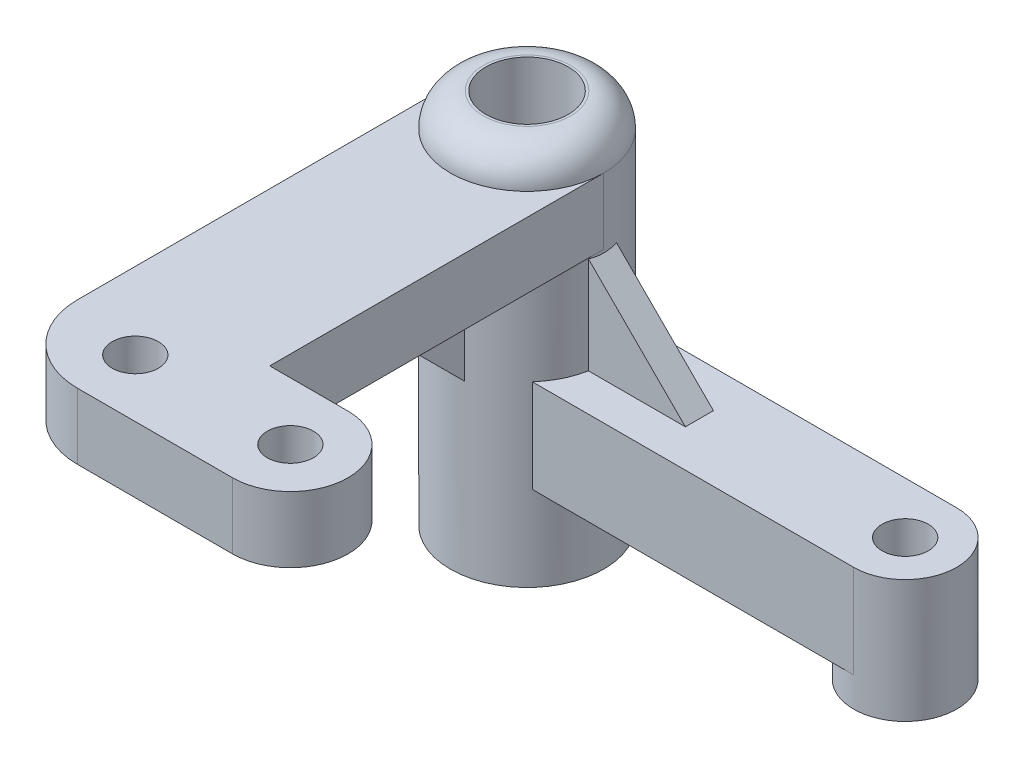
ISO-10303-21;
HEADER;
FILE_DESCRIPTION(('STEP AP214'),'2;1');
FILE_NAME('part.step','',(''),(''),'','','');
FILE_SCHEMA(('AUTOMOTIVE_DESIGN { 1 0 10303 214 1 1 1 1 }'));
ENDSEC;
DATA;
#1=APPLICATION_CONTEXT('core data for automotive mechanical design processes');
#2=APPLICATION_PROTOCOL_DEFINITION('international standard','automotive_design',2000,#1);
#3=PRODUCT_CONTEXT('',#1,'mechanical');
#4=PRODUCT('Part','Part','',(#3));
#5=PRODUCT_RELATED_PRODUCT_CATEGORY('part','',(#4));
#6=PRODUCT_DEFINITION_FORMATION('','',#4);
#7=PRODUCT_DEFINITION_CONTEXT('part definition',#1,'design');
#8=PRODUCT_DEFINITION('design','',#6,#7);
#9=PRODUCT_DEFINITION_SHAPE('','',#8);
#10=(LENGTH_UNIT() NAMED_UNIT(*) SI_UNIT(.MILLI.,.METRE.));
#11=(NAMED_UNIT(*) PLANE_ANGLE_UNIT() SI_UNIT($,.RADIAN.));
#12=(NAMED_UNIT(*) SI_UNIT($,.STERADIAN.) SOLID_ANGLE_UNIT());
#13=UNCERTAINTY_MEASURE_WITH_UNIT(LENGTH_MEASURE(1.E-05),#10,'distance_accuracy_value','');
#14=(GEOMETRIC_REPRESENTATION_CONTEXT(3) GLOBAL_UNCERTAINTY_ASSIGNED_CONTEXT((#13)) GLOBAL_UNIT_ASSIGNED_CONTEXT((#10,
#11,#12)) REPRESENTATION_CONTEXT('',''));
#15=CARTESIAN_POINT('',(0.,0.,0.));
#16=DIRECTION('',(0.,0.,1.));
#17=DIRECTION('',(1.,0.,0.));
#18=AXIS2_PLACEMENT_3D('',#15,#16,#17);
#19=CARTESIAN_POINT('',(0.,-11.65,0.));
#20=DIRECTION('',(0.,1.,0.));
#21=DIRECTION('',(0.,0.,1.));
#22=AXIS2_PLACEMENT_3D('',#19,#20,#21);
#23=PLANE('',#22);
#24=CARTESIAN_POINT('',(0.,-11.65,-22.6));
#25=DIRECTION('',(0.,1.,0.));
#26=DIRECTION('',(0.,0.,1.));
#27=AXIS2_PLACEMENT_3D('',#24,#25,#26);
#28=CIRCLE('',#27,4.65);
#29=CARTESIAN_POINT('',(3.44338133235342,-11.65,-19.475));
#30=VERTEX_POINT('',#29);
#31=CARTESIAN_POINT('',(3.44338133235342,-11.65,-25.725));
#32=VERTEX_POINT('',#31);
#33=EDGE_CURVE('E200',#30,#32,#28,.T.);
#34=ORIENTED_EDGE('',*,*,#33,.T.);
#35=DIRECTION('',(1.,0.,0.));
#36=VECTOR('',#35,1.);
#37=CARTESIAN_POINT('',(0.,-11.65,-25.725));
#38=LINE('',#37,#36);
#39=CARTESIAN_POINT('',(22.925,-11.65,-25.725));
#40=VERTEX_POINT('',#39);
#41=EDGE_CURVE('E208',#32,#40,#38,.T.);
#42=ORIENTED_EDGE('',*,*,#41,.T.);
#43=CARTESIAN_POINT('',(22.925,-11.65,-22.6));
#44=DIRECTION('',(0.,1.,0.));
#45=DIRECTION('',(0.,0.,1.));
#46=AXIS2_PLACEMENT_3D('',#43,#44,#45);
#47=CIRCLE('',#46,3.125);
#48=CARTESIAN_POINT('',(22.925,-11.65,-19.475));
#49=VERTEX_POINT('',#48);
#50=EDGE_CURVE('E380',#49,#40,#47,.F.);
#51=ORIENTED_EDGE('',*,*,#50,.F.);
#52=DIRECTION('',(1.,0.,0.));
#53=VECTOR('',#52,1.);
#54=CARTESIAN_POINT('',(0.,-11.65,-19.475));
#55=LINE('',#54,#53);
#56=EDGE_CURVE('E203',#30,#49,#55,.T.);
#57=ORIENTED_EDGE('',*,*,#56,.F.);
#58=EDGE_LOOP('',(#34,#42,#51,#57));
#59=FACE_BOUND('',#58,.T.);
#60=ADVANCED_FACE('F43',(#59),#23,.F.);
#61=CARTESIAN_POINT('',(0.,4.,-22.6));
#62=DIRECTION('',(0.,-1.,0.));
#63=DIRECTION('',(0.,0.,-1.));
#64=AXIS2_PLACEMENT_3D('',#61,#62,#63);
#65=CYLINDRICAL_SURFACE('',#64,4.65);
#66=CARTESIAN_POINT('',(0.,-16.8,-22.6));
#67=DIRECTION('',(0.,-1.,0.));
#68=DIRECTION('',(0.,0.,1.));
#69=AXIS2_PLACEMENT_3D('',#66,#67,#68);
#70=CIRCLE('',#69,4.65);
#71=CARTESIAN_POINT('',(0.,-16.8,-17.95));
#72=VERTEX_POINT('',#71);
#73=EDGE_CURVE('E279',#72,#72,#70,.T.);
#74=ORIENTED_EDGE('',*,*,#73,.F.);
#75=EDGE_LOOP('',(#74));
#76=FACE_BOUND('',#75,.T.);
#77=DIRECTION('',(0.,1.,0.));
#78=VECTOR('',#77,1.);
#79=CARTESIAN_POINT('',(3.44338133235342,-11.65,-25.725));
#80=LINE('',#79,#78);
#81=CARTESIAN_POINT('',(3.44338133235342,-6.,-25.725));
#82=VERTEX_POINT('',#81);
#83=EDGE_CURVE('E227',#32,#82,#80,.T.);
#84=ORIENTED_EDGE('',*,*,#83,.F.);
#85=ORIENTED_EDGE('',*,*,#33,.F.);
#86=DIRECTION('',(0.,1.,0.));
#87=VECTOR('',#86,1.);
#88=CARTESIAN_POINT('',(3.44338133235342,-11.65,-19.475));
#89=LINE('',#88,#87);
#90=CARTESIAN_POINT('',(3.44338133235342,-6.,-19.475));
#91=VERTEX_POINT('',#90);
#92=EDGE_CURVE('E212',#30,#91,#89,.T.);
#93=ORIENTED_EDGE('',*,*,#92,.T.);
#94=CARTESIAN_POINT('',(0.,-6.,-22.6));
#95=DIRECTION('',(0.,1.,0.));
#96=DIRECTION('',(0.,0.,1.));
#97=AXIS2_PLACEMENT_3D('',#94,#95,#96);
#98=CIRCLE('',#97,4.65);
#99=CARTESIAN_POINT('',(4.57165178026499,-6.,-21.75));
#100=VERTEX_POINT('',#99);
#101=EDGE_CURVE('E213',#91,#100,#98,.T.);
#102=ORIENTED_EDGE('',*,*,#101,.T.);
#103=DIRECTION('',(0.,-1.,0.));
#104=VECTOR('',#103,1.);
#105=CARTESIAN_POINT('',(4.57165178026499,4.,-21.75));
#106=LINE('',#105,#104);
#107=CARTESIAN_POINT('',(4.57165178026499,-0.121651780264962,-21.75));
#108=VERTEX_POINT('',#107);
#109=EDGE_CURVE('E167',#100,#108,#106,.F.);
#110=ORIENTED_EDGE('',*,*,#109,.T.);
#111=CARTESIAN_POINT('',(0.,4.45000000000004,-22.6));
#112=DIRECTION('',(-0.707106781186549,-0.707106781186546,0.));
#113=DIRECTION('',(0.707106781186546,-0.707106781186549,0.));
#114=AXIS2_PLACEMENT_3D('',#111,#112,#113);
#115=ELLIPSE('',#114,6.5760930650349,4.65);
#116=CARTESIAN_POINT('',(4.57165178026499,-0.121651780264962,-23.45));
#117=VERTEX_POINT('',#116);
#118=EDGE_CURVE('E173',#108,#117,#115,.F.);
#119=ORIENTED_EDGE('',*,*,#118,.T.);
#120=DIRECTION('',(0.,-1.,0.));
#121=VECTOR('',#120,1.);
#122=CARTESIAN_POINT('',(4.57165178026499,4.,-23.45));
#123=LINE('',#122,#121);
#124=CARTESIAN_POINT('',(4.57165178026499,-6.,-23.45));
#125=VERTEX_POINT('',#124);
#126=EDGE_CURVE('E161',#125,#117,#123,.F.);
#127=ORIENTED_EDGE('',*,*,#126,.F.);
#128=EDGE_CURVE('E67',#125,#82,#98,.T.);
#129=ORIENTED_EDGE('',*,*,#128,.T.);
#130=EDGE_LOOP('',(#84,#85,#93,#102,#110,#119,#127,#129));
#131=FACE_BOUND('',#130,.T.);
#132=DIRECTION('',(0.,-1.,0.));
#133=VECTOR('',#132,1.);
#134=CARTESIAN_POINT('',(-0.8,4.,-18.0193341095426));
#135=LINE('',#134,#133);
#136=CARTESIAN_POINT('',(-0.8,0.,-18.0193341095426));
#137=VERTEX_POINT('',#136);
#138=CARTESIAN_POINT('',(-0.8,-6.56933410954262,-18.0193341095426));
#139=VERTEX_POINT('',#138);
#140=EDGE_CURVE('E253',#137,#139,#135,.T.);
#141=ORIENTED_EDGE('',*,*,#140,.F.);
#142=CARTESIAN_POINT('',(0.,0.,-22.6));
#143=DIRECTION('',(0.,1.,0.));
#144=DIRECTION('',(0.,0.,-1.));
#145=AXIS2_PLACEMENT_3D('',#142,#143,#144);
#146=CIRCLE('',#145,4.65);
#147=CARTESIAN_POINT('',(-4.65,0.,-22.6));
#148=VERTEX_POINT('',#147);
#149=EDGE_CURVE('E280',#148,#137,#146,.T.);
#150=ORIENTED_EDGE('',*,*,#149,.F.);
#151=DIRECTION('',(0.,-1.,0.));
#152=VECTOR('',#151,1.);
#153=CARTESIAN_POINT('',(-4.65,4.,-22.6));
#154=LINE('',#153,#152);
#155=CARTESIAN_POINT('',(-4.65,4.,-22.6));
#156=VERTEX_POINT('',#155);
#157=EDGE_CURVE('E364',#156,#148,#154,.T.);
#158=ORIENTED_EDGE('',*,*,#157,.F.);
#159=CARTESIAN_POINT('',(0.,4.,-22.6));
#160=DIRECTION('',(0.,-1.,0.));
#161=DIRECTION('',(0.,0.,1.));
#162=AXIS2_PLACEMENT_3D('',#159,#160,#161);
#163=CIRCLE('',#162,4.65);
#164=CARTESIAN_POINT('',(4.65,4.,-22.6));
#165=VERTEX_POINT('',#164);
#166=EDGE_CURVE('E376',#165,#156,#163,.F.);
#167=ORIENTED_EDGE('',*,*,#166,.F.);
#168=DIRECTION('',(0.,-1.,0.));
#169=VECTOR('',#168,1.);
#170=CARTESIAN_POINT('',(4.65,4.,-22.6));
#171=LINE('',#170,#169);
#172=CARTESIAN_POINT('',(4.65,0.,-22.6));
#173=VERTEX_POINT('',#172);
#174=EDGE_CURVE('E361',#165,#173,#171,.T.);
#175=ORIENTED_EDGE('',*,*,#174,.T.);
#176=CARTESIAN_POINT('',(0.8,0.,-18.0193341095426));
#177=VERTEX_POINT('',#176);
#178=EDGE_CURVE('E284',#177,#173,#146,.T.);
#179=ORIENTED_EDGE('',*,*,#178,.F.);
#180=DIRECTION('',(0.,-1.,0.));
#181=VECTOR('',#180,1.);
#182=CARTESIAN_POINT('',(0.8,4.,-18.0193341095426));
#183=LINE('',#182,#181);
#184=CARTESIAN_POINT('',(0.8,-6.56933410954261,-18.0193341095426));
#185=VERTEX_POINT('',#184);
#186=EDGE_CURVE('E243',#177,#185,#183,.T.);
#187=ORIENTED_EDGE('',*,*,#186,.T.);
#188=CARTESIAN_POINT('',(0.,-11.15,-22.6));
#189=DIRECTION('',(0.,0.707106781186546,-0.707106781186549));
#190=DIRECTION('',(0.,-0.707106781186549,-0.707106781186546));
#191=AXIS2_PLACEMENT_3D('',#188,#189,#190);
#192=ELLIPSE('',#191,6.5760930650349,4.65);
#193=EDGE_CURVE('E261',#139,#185,#192,.T.);
#194=ORIENTED_EDGE('',*,*,#193,.F.);
#195=EDGE_LOOP('',(#141,#150,#158,#167,#175,#179,#187,#194));
#196=FACE_BOUND('',#195,.T.);
#197=ADVANCED_FACE('F179',(#76,#131,#196),#65,.T.);
#198=CARTESIAN_POINT('',(0.,0.,0.));
#199=DIRECTION('',(0.,1.,0.));
#200=DIRECTION('',(0.,0.,1.));
#201=AXIS2_PLACEMENT_3D('',#198,#199,#200);
#202=PLANE('',#201);
#203=CARTESIAN_POINT('',(0.,0.,1.15));
#204=DIRECTION('',(0.,-1.,0.));
#205=DIRECTION('',(0.,0.,1.));
#206=AXIS2_PLACEMENT_3D('',#203,#204,#205);
#207=CIRCLE('',#206,1.4);
#208=CARTESIAN_POINT('',(0.,0.,2.55));
#209=VERTEX_POINT('',#208);
#210=EDGE_CURVE('E297',#209,#209,#207,.T.);
#211=ORIENTED_EDGE('',*,*,#210,.F.);
#212=EDGE_LOOP('',(#211));
#213=FACE_BOUND('',#212,.T.);
#214=CARTESIAN_POINT('',(9.4,0.,1.15));
#215=DIRECTION('',(0.,-1.,0.));
#216=DIRECTION('',(0.,0.,1.));
#217=AXIS2_PLACEMENT_3D('',#214,#215,#216);
#218=CIRCLE('',#217,1.4);
#219=CARTESIAN_POINT('',(9.4,0.,2.55));
#220=VERTEX_POINT('',#219);
#221=EDGE_CURVE('E346',#220,#220,#218,.T.);
#222=ORIENTED_EDGE('',*,*,#221,.F.);
#223=EDGE_LOOP('',(#222));
#224=FACE_BOUND('',#223,.T.);
#225=DIRECTION('',(0.,0.,-1.));
#226=VECTOR('',#225,1.);
#227=CARTESIAN_POINT('',(-4.65,0.,0.));
#228=LINE('',#227,#226);
#229=CARTESIAN_POINT('',(-4.65,0.,0.));
#230=VERTEX_POINT('',#229);
#231=EDGE_CURVE('E331',#230,#148,#228,.T.);
#232=ORIENTED_EDGE('',*,*,#231,.T.);
#233=ORIENTED_EDGE('',*,*,#149,.T.);
#234=DIRECTION('',(0.,0.,-1.));
#235=VECTOR('',#234,1.);
#236=CARTESIAN_POINT('',(-0.8,0.,0.));
#237=LINE('',#236,#235);
#238=CARTESIAN_POINT('',(-0.8,0.,-11.45));
#239=VERTEX_POINT('',#238);
#240=EDGE_CURVE('E257',#239,#137,#237,.T.);
#241=ORIENTED_EDGE('',*,*,#240,.F.);
#242=DIRECTION('',(-1.,0.,0.));
#243=VECTOR('',#242,1.);
#244=CARTESIAN_POINT('',(0.,0.,-11.45));
#245=LINE('',#244,#243);
#246=CARTESIAN_POINT('',(0.8,0.,-11.45));
#247=VERTEX_POINT('',#246);
#248=EDGE_CURVE('E265',#247,#239,#245,.T.);
#249=ORIENTED_EDGE('',*,*,#248,.F.);
#250=DIRECTION('',(0.,0.,-1.));
#251=VECTOR('',#250,1.);
#252=CARTESIAN_POINT('',(0.8,0.,0.));
#253=LINE('',#252,#251);
#254=EDGE_CURVE('E249',#247,#177,#253,.T.);
#255=ORIENTED_EDGE('',*,*,#254,.T.);
#256=ORIENTED_EDGE('',*,*,#178,.T.);
#257=DIRECTION('',(0.,0.,-1.));
#258=VECTOR('',#257,1.);
#259=CARTESIAN_POINT('',(4.65,0.,0.));
#260=LINE('',#259,#258);
#261=CARTESIAN_POINT('',(4.65,0.,-2.35));
#262=VERTEX_POINT('',#261);
#263=EDGE_CURVE('E334',#262,#173,#260,.T.);
#264=ORIENTED_EDGE('',*,*,#263,.F.);
#265=DIRECTION('',(1.,0.,0.));
#266=VECTOR('',#265,1.);
#267=CARTESIAN_POINT('',(0.,0.,-2.35));
#268=LINE('',#267,#266);
#269=CARTESIAN_POINT('',(9.4,0.,-2.35));
#270=VERTEX_POINT('',#269);
#271=EDGE_CURVE('E338',#262,#270,#268,.T.);
#272=ORIENTED_EDGE('',*,*,#271,.T.);
#273=CARTESIAN_POINT('',(9.4,0.,1.15));
#274=DIRECTION('',(0.,-1.,0.));
#275=DIRECTION('',(0.,0.,1.));
#276=AXIS2_PLACEMENT_3D('',#273,#274,#275);
#277=CIRCLE('',#276,3.5);
#278=CARTESIAN_POINT('',(9.4,0.,4.65));
#279=VERTEX_POINT('',#278);
#280=EDGE_CURVE('E342',#270,#279,#277,.T.);
#281=ORIENTED_EDGE('',*,*,#280,.T.);
#282=DIRECTION('',(1.,0.,0.));
#283=VECTOR('',#282,1.);
#284=CARTESIAN_POINT('',(0.,0.,4.65));
#285=LINE('',#284,#283);
#286=CARTESIAN_POINT('',(0.,0.,4.65));
#287=VERTEX_POINT('',#286);
#288=EDGE_CURVE('E291',#287,#279,#285,.T.);
#289=ORIENTED_EDGE('',*,*,#288,.F.);
#290=CARTESIAN_POINT('',(0.,0.,0.));
#291=DIRECTION('',(0.,-1.,0.));
#292=DIRECTION('',(0.,0.,1.));
#293=AXIS2_PLACEMENT_3D('',#290,#291,#292);
#294=CIRCLE('',#293,4.65);
#295=EDGE_CURVE('E327',#287,#230,#294,.T.);
#296=ORIENTED_EDGE('',*,*,#295,.T.);
#297=EDGE_LOOP('',(#232,#233,#241,#249,#255,#256,#264,#272,#281,#289,#296));
#298=FACE_BOUND('',#297,.T.);
#299=ADVANCED_FACE('F391',(#213,#224,#298),#202,.F.);
#300=CARTESIAN_POINT('',(0.,4.,4.65));
#301=DIRECTION('',(0.,0.,1.));
#302=DIRECTION('',(-1.,0.,0.));
#303=AXIS2_PLACEMENT_3D('',#300,#301,#302);
#304=PLANE('',#303);
#305=ORIENTED_EDGE('',*,*,#288,.T.);
#306=DIRECTION('',(0.,-1.,0.));
#307=VECTOR('',#306,1.);
#308=CARTESIAN_POINT('',(9.4,4.,4.65));
#309=LINE('',#308,#307);
#310=CARTESIAN_POINT('',(9.4,4.,4.65));
#311=VERTEX_POINT('',#310);
#312=EDGE_CURVE('E323',#311,#279,#309,.T.);
#313=ORIENTED_EDGE('',*,*,#312,.F.);
#314=DIRECTION('',(1.,0.,0.));
#315=VECTOR('',#314,1.);
#316=CARTESIAN_POINT('',(0.,4.,4.65));
#317=LINE('',#316,#315);
#318=CARTESIAN_POINT('',(0.,4.,4.65));
#319=VERTEX_POINT('',#318);
#320=EDGE_CURVE('E292',#319,#311,#317,.T.);
#321=ORIENTED_EDGE('',*,*,#320,.F.);
#322=DIRECTION('',(0.,-1.,0.));
#323=VECTOR('',#322,1.);
#324=CARTESIAN_POINT('',(0.,4.,4.65));
#325=LINE('',#324,#323);
#326=EDGE_CURVE('E275',#319,#287,#325,.T.);
#327=ORIENTED_EDGE('',*,*,#326,.T.);
#328=EDGE_LOOP('',(#305,#313,#321,#327));
#329=FACE_BOUND('',#328,.T.);
#330=ADVANCED_FACE('F414',(#329),#304,.T.);
#331=CARTESIAN_POINT('',(0.,4.,0.));
#332=DIRECTION('',(0.,-1.,0.));
#333=DIRECTION('',(0.,0.,-1.));
#334=AXIS2_PLACEMENT_3D('',#331,#332,#333);
#335=CYLINDRICAL_SURFACE('',#334,4.65);
#336=ORIENTED_EDGE('',*,*,#295,.F.);
#337=ORIENTED_EDGE('',*,*,#326,.F.);
#338=CARTESIAN_POINT('',(0.,4.,0.));
#339=DIRECTION('',(0.,-1.,0.));
#340=DIRECTION('',(0.,0.,1.));
#341=AXIS2_PLACEMENT_3D('',#338,#339,#340);
#342=CIRCLE('',#341,4.65);
#343=CARTESIAN_POINT('',(-4.65,4.,0.));
#344=VERTEX_POINT('',#343);
#345=EDGE_CURVE('E296',#319,#344,#342,.T.);
#346=ORIENTED_EDGE('',*,*,#345,.T.);
#347=DIRECTION('',(0.,-1.,0.));
#348=VECTOR('',#347,1.);
#349=CARTESIAN_POINT('',(-4.65,4.,0.));
#350=LINE('',#349,#348);
#351=EDGE_CURVE('E368',#344,#230,#350,.T.);
#352=ORIENTED_EDGE('',*,*,#351,.T.);
#353=EDGE_LOOP('',(#336,#337,#346,#352));
#354=FACE_BOUND('',#353,.T.);
#355=ADVANCED_FACE('F418',(#354),#335,.T.);
#356=CARTESIAN_POINT('',(-4.65,4.,0.));
#357=DIRECTION('',(1.,0.,0.));
#358=DIRECTION('',(0.,0.,1.));
#359=AXIS2_PLACEMENT_3D('',#356,#357,#358);
#360=PLANE('',#359);
#361=DIRECTION('',(0.,0.,-1.));
#362=VECTOR('',#361,1.);
#363=CARTESIAN_POINT('',(-4.65,4.,0.));
#364=LINE('',#363,#362);
#365=EDGE_CURVE('E301',#344,#156,#364,.T.);
#366=ORIENTED_EDGE('',*,*,#365,.T.);
#367=ORIENTED_EDGE('',*,*,#157,.T.);
#368=ORIENTED_EDGE('',*,*,#231,.F.);
#369=ORIENTED_EDGE('',*,*,#351,.F.);
#370=EDGE_LOOP('',(#366,#367,#368,#369));
#371=FACE_BOUND('',#370,.T.);
#372=ADVANCED_FACE('F424',(#371),#360,.F.);
#373=CARTESIAN_POINT('',(4.65,4.,0.));
#374=DIRECTION('',(1.,0.,0.));
#375=DIRECTION('',(0.,0.,1.));
#376=AXIS2_PLACEMENT_3D('',#373,#374,#375);
#377=PLANE('',#376);
#378=ORIENTED_EDGE('',*,*,#263,.T.);
#379=ORIENTED_EDGE('',*,*,#174,.F.);
#380=DIRECTION('',(0.,0.,-1.));
#381=VECTOR('',#380,1.);
#382=CARTESIAN_POINT('',(4.65,4.,0.));
#383=LINE('',#382,#381);
#384=CARTESIAN_POINT('',(4.65,4.,-2.35));
#385=VERTEX_POINT('',#384);
#386=EDGE_CURVE('E304',#385,#165,#383,.T.);
#387=ORIENTED_EDGE('',*,*,#386,.F.);
#388=DIRECTION('',(0.,-1.,0.));
#389=VECTOR('',#388,1.);
#390=CARTESIAN_POINT('',(4.65,4.,-2.35));
#391=LINE('',#390,#389);
#392=EDGE_CURVE('E358',#385,#262,#391,.T.);
#393=ORIENTED_EDGE('',*,*,#392,.T.);
#394=EDGE_LOOP('',(#378,#379,#387,#393));
#395=FACE_BOUND('',#394,.T.);
#396=ADVANCED_FACE('F401',(#395),#377,.T.);
#397=CARTESIAN_POINT('',(0.,4.,-2.35));
#398=DIRECTION('',(0.,0.,1.));
#399=DIRECTION('',(-1.,0.,0.));
#400=AXIS2_PLACEMENT_3D('',#397,#398,#399);
#401=PLANE('',#400);
#402=ORIENTED_EDGE('',*,*,#271,.F.);
#403=ORIENTED_EDGE('',*,*,#392,.F.);
#404=DIRECTION('',(1.,0.,0.));
#405=VECTOR('',#404,1.);
#406=CARTESIAN_POINT('',(0.,4.,-2.35));
#407=LINE('',#406,#405);
#408=CARTESIAN_POINT('',(9.4,4.,-2.35));
#409=VERTEX_POINT('',#408);
#410=EDGE_CURVE('E308',#385,#409,#407,.T.);
#411=ORIENTED_EDGE('',*,*,#410,.T.);
#412=DIRECTION('',(0.,-1.,0.));
#413=VECTOR('',#412,1.);
#414=CARTESIAN_POINT('',(9.4,4.,-2.35));
#415=LINE('',#414,#413);
#416=EDGE_CURVE('E355',#409,#270,#415,.T.);
#417=ORIENTED_EDGE('',*,*,#416,.T.);
#418=EDGE_LOOP('',(#402,#403,#411,#417));
#419=FACE_BOUND('',#418,.T.);
#420=ADVANCED_FACE('F405',(#419),#401,.F.);
#421=CARTESIAN_POINT('',(0.,4.,1.15));
#422=DIRECTION('',(0.,-1.,0.));
#423=DIRECTION('',(0.,0.,-1.));
#424=AXIS2_PLACEMENT_3D('',#421,#422,#423);
#425=CYLINDRICAL_SURFACE('',#424,1.4);
#426=CARTESIAN_POINT('',(0.,4.,1.15));
#427=DIRECTION('',(0.,-1.,0.));
#428=DIRECTION('',(0.,0.,1.));
#429=AXIS2_PLACEMENT_3D('',#426,#427,#428);
#430=CIRCLE('',#429,1.4);
#431=CARTESIAN_POINT('',(0.,4.,2.55));
#432=VERTEX_POINT('',#431);
#433=EDGE_CURVE('E319',#432,#432,#430,.T.);
#434=ORIENTED_EDGE('',*,*,#433,.F.);
#435=EDGE_LOOP('',(#434));
#436=FACE_BOUND('',#435,.T.);
#437=ORIENTED_EDGE('',*,*,#210,.T.);
#438=EDGE_LOOP('',(#437));
#439=FACE_BOUND('',#438,.T.);
#440=ADVANCED_FACE('F672',(#436,#439),#425,.F.);
#441=CARTESIAN_POINT('',(9.4,4.,1.15));
#442=DIRECTION('',(0.,-1.,0.));
#443=DIRECTION('',(0.,0.,-1.));
#444=AXIS2_PLACEMENT_3D('',#441,#442,#443);
#445=CYLINDRICAL_SURFACE('',#444,1.4);
#446=CARTESIAN_POINT('',(9.4,4.,1.15));
#447=DIRECTION('',(0.,-1.,0.));
#448=DIRECTION('',(0.,0.,1.));
#449=AXIS2_PLACEMENT_3D('',#446,#447,#448);
#450=CIRCLE('',#449,1.4);
#451=CARTESIAN_POINT('',(9.4,4.,2.55));
#452=VERTEX_POINT('',#451);
#453=EDGE_CURVE('E315',#452,#452,#450,.T.);
#454=ORIENTED_EDGE('',*,*,#453,.F.);
#455=EDGE_LOOP('',(#454));
#456=FACE_BOUND('',#455,.T.);
#457=ORIENTED_EDGE('',*,*,#221,.T.);
#458=EDGE_LOOP('',(#457));
#459=FACE_BOUND('',#458,.T.);
#460=ADVANCED_FACE('F662',(#456,#459),#445,.F.);
#461=CARTESIAN_POINT('',(9.4,4.,1.15));
#462=DIRECTION('',(0.,-1.,0.));
#463=DIRECTION('',(0.,0.,-1.));
#464=AXIS2_PLACEMENT_3D('',#461,#462,#463);
#465=CYLINDRICAL_SURFACE('',#464,3.5);
#466=ORIENTED_EDGE('',*,*,#280,.F.);
#467=ORIENTED_EDGE('',*,*,#416,.F.);
#468=CARTESIAN_POINT('',(9.4,4.,1.15));
#469=DIRECTION('',(0.,-1.,0.));
#470=DIRECTION('',(0.,0.,1.));
#471=AXIS2_PLACEMENT_3D('',#468,#469,#470);
#472=CIRCLE('',#471,3.5);
#473=EDGE_CURVE('E312',#409,#311,#472,.T.);
#474=ORIENTED_EDGE('',*,*,#473,.T.);
#475=ORIENTED_EDGE('',*,*,#312,.T.);
#476=EDGE_LOOP('',(#466,#467,#474,#475));
#477=FACE_BOUND('',#476,.T.);
#478=ADVANCED_FACE('F410',(#477),#465,.T.);
#479=CARTESIAN_POINT('',(0.,4.,-22.6));
#480=DIRECTION('',(0.,-1.,0.));
#481=DIRECTION('',(0.,0.,-1.));
#482=AXIS2_PLACEMENT_3D('',#479,#480,#481);
#483=CYLINDRICAL_SURFACE('',#482,2.5);
#484=CARTESIAN_POINT('',(0.,-16.8,-22.6));
#485=DIRECTION('',(0.,-1.,0.));
#486=DIRECTION('',(0.,0.,1.));
#487=AXIS2_PLACEMENT_3D('',#484,#485,#486);
#488=CIRCLE('',#487,2.5);
#489=CARTESIAN_POINT('',(0.,-16.8,-20.1));
#490=VERTEX_POINT('',#489);
#491=EDGE_CURVE('E283',#490,#490,#488,.T.);
#492=ORIENTED_EDGE('',*,*,#491,.T.);
#493=EDGE_LOOP('',(#492));
#494=FACE_BOUND('',#493,.T.);
#495=CARTESIAN_POINT('',(0.,6.00000000000001,-22.6));
#496=DIRECTION('',(0.,-1.,0.));
#497=DIRECTION('',(0.,0.,1.));
#498=AXIS2_PLACEMENT_3D('',#495,#496,#497);
#499=CIRCLE('',#498,2.5);
#500=CARTESIAN_POINT('',(0.,6.00000000000001,-20.1));
#501=VERTEX_POINT('',#500);
#502=EDGE_CURVE('E269',#501,#501,#499,.T.);
#503=ORIENTED_EDGE('',*,*,#502,.F.);
#504=EDGE_LOOP('',(#503));
#505=FACE_BOUND('',#504,.T.);
#506=ADVANCED_FACE('F585',(#494,#505),#483,.F.);
#507=CARTESIAN_POINT('',(0.,4.,0.));
#508=DIRECTION('',(0.,1.,0.));
#509=DIRECTION('',(0.,0.,1.));
#510=AXIS2_PLACEMENT_3D('',#507,#508,#509);
#511=PLANE('',#510);
#512=CARTESIAN_POINT('',(0.,4.,-22.6));
#513=DIRECTION('',(0.,-1.,0.));
#514=DIRECTION('',(0.,0.,1.));
#515=AXIS2_PLACEMENT_3D('',#512,#513,#514);
#516=CIRCLE('',#515,4.65);
#517=EDGE_CURVE('E270',#165,#156,#516,.T.);
#518=ORIENTED_EDGE('',*,*,#517,.T.);
#519=ORIENTED_EDGE('',*,*,#365,.F.);
#520=ORIENTED_EDGE('',*,*,#345,.F.);
#521=ORIENTED_EDGE('',*,*,#320,.T.);
#522=ORIENTED_EDGE('',*,*,#473,.F.);
#523=ORIENTED_EDGE('',*,*,#410,.F.);
#524=ORIENTED_EDGE('',*,*,#386,.T.);
#525=EDGE_LOOP('',(#518,#519,#520,#521,#522,#523,#524));
#526=FACE_BOUND('',#525,.T.);
#527=ORIENTED_EDGE('',*,*,#453,.T.);
#528=EDGE_LOOP('',(#527));
#529=FACE_BOUND('',#528,.T.);
#530=ORIENTED_EDGE('',*,*,#433,.T.);
#531=EDGE_LOOP('',(#530));
#532=FACE_BOUND('',#531,.T.);
#533=ADVANCED_FACE('F590',(#526,#529,#532),#511,.T.);
#534=CARTESIAN_POINT('',(0.,-16.8,0.));
#535=DIRECTION('',(0.,1.,0.));
#536=DIRECTION('',(0.,0.,1.));
#537=AXIS2_PLACEMENT_3D('',#534,#535,#536);
#538=PLANE('',#537);
#539=ORIENTED_EDGE('',*,*,#491,.F.);
#540=EDGE_LOOP('',(#539));
#541=FACE_BOUND('',#540,.T.);
#542=ORIENTED_EDGE('',*,*,#73,.T.);
#543=EDGE_LOOP('',(#542));
#544=FACE_BOUND('',#543,.T.);
#545=ADVANCED_FACE('F603',(#541,#544),#538,.F.);
#546=CARTESIAN_POINT('',(0.,6.,0.));
#547=DIRECTION('',(0.,1.,0.));
#548=DIRECTION('',(0.,0.,1.));
#549=AXIS2_PLACEMENT_3D('',#546,#547,#548);
#550=PLANE('',#549);
#551=ORIENTED_EDGE('',*,*,#502,.T.);
#552=EDGE_LOOP('',(#551));
#553=FACE_BOUND('',#552,.T.);
#554=CARTESIAN_POINT('',(0.,6.,-22.6));
#555=DIRECTION('',(0.,-1.,0.));
#556=DIRECTION('',(0.,0.,1.));
#557=AXIS2_PLACEMENT_3D('',#554,#555,#556);
#558=CIRCLE('',#557,2.65);
#559=CARTESIAN_POINT('',(0.,6.,-19.95));
#560=VERTEX_POINT('',#559);
#561=EDGE_CURVE('E274',#560,#560,#558,.T.);
#562=ORIENTED_EDGE('',*,*,#561,.F.);
#563=EDGE_LOOP('',(#562));
#564=FACE_BOUND('',#563,.T.);
#565=ADVANCED_FACE('F613',(#553,#564),#550,.T.);
#566=CARTESIAN_POINT('',(0.,4.,-22.6));
#567=DIRECTION('',(0.,1.,0.));
#568=DIRECTION('',(0.,0.,1.));
#569=AXIS2_PLACEMENT_3D('',#566,#567,#568);
#570=TOROIDAL_SURFACE('',#569,2.65,2.);
#571=ORIENTED_EDGE('',*,*,#561,.T.);
#572=EDGE_LOOP('',(#571));
#573=FACE_BOUND('',#572,.T.);
#574=ORIENTED_EDGE('',*,*,#166,.T.);
#575=ORIENTED_EDGE('',*,*,#517,.F.);
#576=EDGE_LOOP('',(#574,#575));
#577=FACE_BOUND('',#576,.T.);
#578=ADVANCED_FACE('F45',(#573,#577),#570,.T.);
#579=CARTESIAN_POINT('',(0.,0.,-11.45));
#580=DIRECTION('',(0.,-0.707106781186546,0.707106781186549));
#581=DIRECTION('',(0.,-0.707106781186549,-0.707106781186546));
#582=AXIS2_PLACEMENT_3D('',#579,#580,#581);
#583=PLANE('',#582);
#584=ORIENTED_EDGE('',*,*,#248,.T.);
#585=DIRECTION('',(0.,-0.707106781186549,-0.707106781186546));
#586=VECTOR('',#585,1.);
#587=CARTESIAN_POINT('',(-0.8,0.,-11.45));
#588=LINE('',#587,#586);
#589=EDGE_CURVE('E240',#239,#139,#588,.T.);
#590=ORIENTED_EDGE('',*,*,#589,.T.);
#591=ORIENTED_EDGE('',*,*,#193,.T.);
#592=DIRECTION('',(0.,-0.707106781186549,-0.707106781186546));
#593=VECTOR('',#592,1.);
#594=CARTESIAN_POINT('',(0.8,0.,-11.45));
#595=LINE('',#594,#593);
#596=EDGE_CURVE('E230',#247,#185,#595,.T.);
#597=ORIENTED_EDGE('',*,*,#596,.F.);
#598=EDGE_LOOP('',(#584,#590,#591,#597));
#599=FACE_BOUND('',#598,.T.);
#600=ADVANCED_FACE('F428',(#599),#583,.T.);
#601=CARTESIAN_POINT('',(-0.8,-5.4,-11.3));
#602=DIRECTION('',(-1.,0.,0.));
#603=DIRECTION('',(0.,0.,-1.));
#604=AXIS2_PLACEMENT_3D('',#601,#602,#603);
#605=PLANE('',#604);
#606=ORIENTED_EDGE('',*,*,#140,.T.);
#607=ORIENTED_EDGE('',*,*,#589,.F.);
#608=ORIENTED_EDGE('',*,*,#240,.T.);
#609=EDGE_LOOP('',(#606,#607,#608));
#610=FACE_BOUND('',#609,.T.);
#611=ADVANCED_FACE('F426',(#610),#605,.T.);
#612=CARTESIAN_POINT('',(0.8,-5.4,-11.3));
#613=DIRECTION('',(-1.,0.,0.));
#614=DIRECTION('',(0.,0.,-1.));
#615=AXIS2_PLACEMENT_3D('',#612,#613,#614);
#616=PLANE('',#615);
#617=ORIENTED_EDGE('',*,*,#596,.T.);
#618=ORIENTED_EDGE('',*,*,#186,.F.);
#619=ORIENTED_EDGE('',*,*,#254,.F.);
#620=EDGE_LOOP('',(#617,#618,#619));
#621=FACE_BOUND('',#620,.T.);
#622=ADVANCED_FACE('F430',(#621),#616,.F.);
#623=CARTESIAN_POINT('',(0.,-11.65,-25.725));
#624=DIRECTION('',(0.,0.,1.));
#625=DIRECTION('',(1.,0.,0.));
#626=AXIS2_PLACEMENT_3D('',#623,#624,#625);
#627=PLANE('',#626);
#628=DIRECTION('',(1.,0.,0.));
#629=VECTOR('',#628,1.);
#630=CARTESIAN_POINT('',(0.,-6.,-25.725));
#631=LINE('',#630,#629);
#632=CARTESIAN_POINT('',(22.925,-6.,-25.725));
#633=VERTEX_POINT('',#632);
#634=EDGE_CURVE('E204',#82,#633,#631,.T.);
#635=ORIENTED_EDGE('',*,*,#634,.T.);
#636=DIRECTION('',(0.,1.,0.));
#637=VECTOR('',#636,1.);
#638=CARTESIAN_POINT('',(22.925,-11.65,-25.725));
#639=LINE('',#638,#637);
#640=EDGE_CURVE('E231',#40,#633,#639,.T.);
#641=ORIENTED_EDGE('',*,*,#640,.F.);
#642=ORIENTED_EDGE('',*,*,#41,.F.);
#643=ORIENTED_EDGE('',*,*,#83,.T.);
#644=EDGE_LOOP('',(#635,#641,#642,#643));
#645=FACE_BOUND('',#644,.T.);
#646=ADVANCED_FACE('F432',(#645),#627,.F.);
#647=CARTESIAN_POINT('',(22.925,-11.65,-22.6));
#648=DIRECTION('',(0.,1.,0.));
#649=DIRECTION('',(0.,0.,1.));
#650=AXIS2_PLACEMENT_3D('',#647,#648,#649);
#651=CYLINDRICAL_SURFACE('',#650,3.125);
#652=CARTESIAN_POINT('',(22.925,-6.,-22.6));
#653=DIRECTION('',(0.,1.,0.));
#654=DIRECTION('',(0.,0.,1.));
#655=AXIS2_PLACEMENT_3D('',#652,#653,#654);
#656=CIRCLE('',#655,3.125);
#657=CARTESIAN_POINT('',(22.925,-6.,-19.475));
#658=VERTEX_POINT('',#657);
#659=EDGE_CURVE('E220',#658,#633,#656,.T.);
#660=ORIENTED_EDGE('',*,*,#659,.F.);
#661=DIRECTION('',(0.,1.,0.));
#662=VECTOR('',#661,1.);
#663=CARTESIAN_POINT('',(22.925,-11.65,-19.475));
#664=LINE('',#663,#662);
#665=EDGE_CURVE('E234',#49,#658,#664,.T.);
#666=ORIENTED_EDGE('',*,*,#665,.F.);
#667=ORIENTED_EDGE('',*,*,#50,.T.);
#668=ORIENTED_EDGE('',*,*,#640,.T.);
#669=EDGE_LOOP('',(#660,#666,#667,#668));
#670=FACE_BOUND('',#669,.T.);
#671=CARTESIAN_POINT('',(22.925,-13.45,-22.6));
#672=DIRECTION('',(0.,-1.,0.));
#673=DIRECTION('',(0.,0.,-1.));
#674=AXIS2_PLACEMENT_3D('',#671,#672,#673);
#675=CIRCLE('',#674,3.125);
#676=CARTESIAN_POINT('',(22.925,-13.45,-25.725));
#677=VERTEX_POINT('',#676);
#678=EDGE_CURVE('E196',#677,#677,#675,.T.);
#679=ORIENTED_EDGE('',*,*,#678,.F.);
#680=EDGE_LOOP('',(#679));
#681=FACE_BOUND('',#680,.T.);
#682=ADVANCED_FACE('F438',(#670,#681),#651,.T.);
#683=CARTESIAN_POINT('',(0.,-11.65,-19.475));
#684=DIRECTION('',(0.,0.,1.));
#685=DIRECTION('',(1.,0.,0.));
#686=AXIS2_PLACEMENT_3D('',#683,#684,#685);
#687=PLANE('',#686);
#688=DIRECTION('',(1.,0.,0.));
#689=VECTOR('',#688,1.);
#690=CARTESIAN_POINT('',(0.,-6.,-19.475));
#691=LINE('',#690,#689);
#692=EDGE_CURVE('E216',#91,#658,#691,.T.);
#693=ORIENTED_EDGE('',*,*,#692,.F.);
#694=ORIENTED_EDGE('',*,*,#92,.F.);
#695=ORIENTED_EDGE('',*,*,#56,.T.);
#696=ORIENTED_EDGE('',*,*,#665,.T.);
#697=EDGE_LOOP('',(#693,#694,#695,#696));
#698=FACE_BOUND('',#697,.T.);
#699=ADVANCED_FACE('F457',(#698),#687,.T.);
#700=CARTESIAN_POINT('',(0.,-6.,0.));
#701=DIRECTION('',(0.,1.,0.));
#702=DIRECTION('',(0.,0.,1.));
#703=AXIS2_PLACEMENT_3D('',#700,#701,#702);
#704=PLANE('',#703);
#705=DIRECTION('',(1.,0.,0.));
#706=VECTOR('',#705,1.);
#707=CARTESIAN_POINT('',(0.,-6.,-21.75));
#708=LINE('',#707,#706);
#709=CARTESIAN_POINT('',(10.45,-6.,-21.75));
#710=VERTEX_POINT('',#709);
#711=EDGE_CURVE('E12',#100,#710,#708,.T.);
#712=ORIENTED_EDGE('',*,*,#711,.F.);
#713=ORIENTED_EDGE('',*,*,#101,.F.);
#714=ORIENTED_EDGE('',*,*,#692,.T.);
#715=ORIENTED_EDGE('',*,*,#659,.T.);
#716=ORIENTED_EDGE('',*,*,#634,.F.);
#717=ORIENTED_EDGE('',*,*,#128,.F.);
#718=DIRECTION('',(1.,0.,0.));
#719=VECTOR('',#718,1.);
#720=CARTESIAN_POINT('',(0.,-6.,-23.45));
#721=LINE('',#720,#719);
#722=CARTESIAN_POINT('',(10.45,-6.,-23.45));
#723=VERTEX_POINT('',#722);
#724=EDGE_CURVE('E164',#125,#723,#721,.T.);
#725=ORIENTED_EDGE('',*,*,#724,.T.);
#726=DIRECTION('',(0.,0.,1.));
#727=VECTOR('',#726,1.);
#728=CARTESIAN_POINT('',(10.45,-6.,0.));
#729=LINE('',#728,#727);
#730=EDGE_CURVE('E52',#710,#723,#729,.F.);
#731=ORIENTED_EDGE('',*,*,#730,.F.);
#732=EDGE_LOOP('',(#712,#713,#714,#715,#716,#717,#725,#731));
#733=FACE_BOUND('',#732,.T.);
#734=CARTESIAN_POINT('',(22.925,-6.,-22.6));
#735=DIRECTION('',(0.,1.,0.));
#736=DIRECTION('',(0.,0.,1.));
#737=AXIS2_PLACEMENT_3D('',#734,#735,#736);
#738=CIRCLE('',#737,1.4);
#739=CARTESIAN_POINT('',(22.925,-6.,-21.2));
#740=VERTEX_POINT('',#739);
#741=EDGE_CURVE('E189',#740,#740,#738,.T.);
#742=ORIENTED_EDGE('',*,*,#741,.F.);
#743=EDGE_LOOP('',(#742));
#744=FACE_BOUND('',#743,.T.);
#745=ADVANCED_FACE('F455',(#733,#744),#704,.T.);
#746=CARTESIAN_POINT('',(22.925,-13.45,-22.6));
#747=DIRECTION('',(0.,-1.,0.));
#748=DIRECTION('',(0.,0.,-1.));
#749=AXIS2_PLACEMENT_3D('',#746,#747,#748);
#750=PLANE('',#749);
#751=CARTESIAN_POINT('',(22.925,-13.45,-22.6));
#752=DIRECTION('',(0.,-1.,0.));
#753=DIRECTION('',(0.,0.,-1.));
#754=AXIS2_PLACEMENT_3D('',#751,#752,#753);
#755=CIRCLE('',#754,1.4);
#756=CARTESIAN_POINT('',(22.925,-13.45,-24.));
#757=VERTEX_POINT('',#756);
#758=EDGE_CURVE('E184',#757,#757,#755,.T.);
#759=ORIENTED_EDGE('',*,*,#758,.F.);
#760=EDGE_LOOP('',(#759));
#761=FACE_BOUND('',#760,.T.);
#762=ORIENTED_EDGE('',*,*,#678,.T.);
#763=EDGE_LOOP('',(#762));
#764=FACE_BOUND('',#763,.T.);
#765=ADVANCED_FACE('F453',(#761,#764),#750,.T.);
#766=CARTESIAN_POINT('',(22.925,6.00000000000001,-22.6));
#767=DIRECTION('',(0.,-1.,0.));
#768=DIRECTION('',(0.,0.,-1.));
#769=AXIS2_PLACEMENT_3D('',#766,#767,#768);
#770=CYLINDRICAL_SURFACE('',#769,1.4);
#771=ORIENTED_EDGE('',*,*,#741,.T.);
#772=EDGE_LOOP('',(#771));
#773=FACE_BOUND('',#772,.T.);
#774=ORIENTED_EDGE('',*,*,#758,.T.);
#775=EDGE_LOOP('',(#774));
#776=FACE_BOUND('',#775,.T.);
#777=ADVANCED_FACE('F488',(#773,#776),#770,.F.);
#778=CARTESIAN_POINT('',(4.65,-0.199999999999978,-22.6));
#779=DIRECTION('',(-0.707106781186549,-0.707106781186546,0.));
#780=DIRECTION('',(0.707106781186546,-0.707106781186549,0.));
#781=AXIS2_PLACEMENT_3D('',#778,#779,#780);
#782=PLANE('',#781);
#783=ORIENTED_EDGE('',*,*,#118,.F.);
#784=DIRECTION('',(0.707106781186546,-0.707106781186549,0.));
#785=VECTOR('',#784,1.);
#786=CARTESIAN_POINT('',(4.65,-0.199999999999978,-21.75));
#787=LINE('',#786,#785);
#788=EDGE_CURVE('E168',#108,#710,#787,.T.);
#789=ORIENTED_EDGE('',*,*,#788,.T.);
#790=ORIENTED_EDGE('',*,*,#730,.T.);
#791=DIRECTION('',(0.707106781186546,-0.707106781186549,0.));
#792=VECTOR('',#791,1.);
#793=CARTESIAN_POINT('',(4.65,-0.199999999999978,-23.45));
#794=LINE('',#793,#792);
#795=EDGE_CURVE('E59',#117,#723,#794,.T.);
#796=ORIENTED_EDGE('',*,*,#795,.F.);
#797=EDGE_LOOP('',(#783,#789,#790,#796));
#798=FACE_BOUND('',#797,.T.);
#799=ADVANCED_FACE('F171',(#798),#782,.F.);
#800=CARTESIAN_POINT('',(10.7,-5.4,-21.75));
#801=DIRECTION('',(0.,0.,1.));
#802=DIRECTION('',(1.,0.,0.));
#803=AXIS2_PLACEMENT_3D('',#800,#801,#802);
#804=PLANE('',#803);
#805=ORIENTED_EDGE('',*,*,#109,.F.);
#806=ORIENTED_EDGE('',*,*,#711,.T.);
#807=ORIENTED_EDGE('',*,*,#788,.F.);
#808=EDGE_LOOP('',(#805,#806,#807));
#809=FACE_BOUND('',#808,.T.);
#810=ADVANCED_FACE('F478',(#809),#804,.T.);
#811=CARTESIAN_POINT('',(10.7,-5.4,-23.45));
#812=DIRECTION('',(0.,0.,1.));
#813=DIRECTION('',(1.,0.,0.));
#814=AXIS2_PLACEMENT_3D('',#811,#812,#813);
#815=PLANE('',#814);
#816=ORIENTED_EDGE('',*,*,#724,.F.);
#817=ORIENTED_EDGE('',*,*,#126,.T.);
#818=ORIENTED_EDGE('',*,*,#795,.T.);
#819=EDGE_LOOP('',(#816,#817,#818));
#820=FACE_BOUND('',#819,.T.);
#821=ADVANCED_FACE('F162',(#820),#815,.F.);
#822=CLOSED_SHELL('',(#60,#197,#299,#330,#355,#372,#396,#420,#440,#460,#478,#506,#533,#545,#565,
#578,#600,#611,#622,#646,#682,#699,#745,#765,#777,#799,#810,#821));
#823=MANIFOLD_SOLID_BREP('B2',#822);
#824=ADVANCED_BREP_SHAPE_REPRESENTATION('',(#18,#823),#14);
#825=SHAPE_DEFINITION_REPRESENTATION(#9,#824);
ENDSEC;
END-ISO-10303-21;
